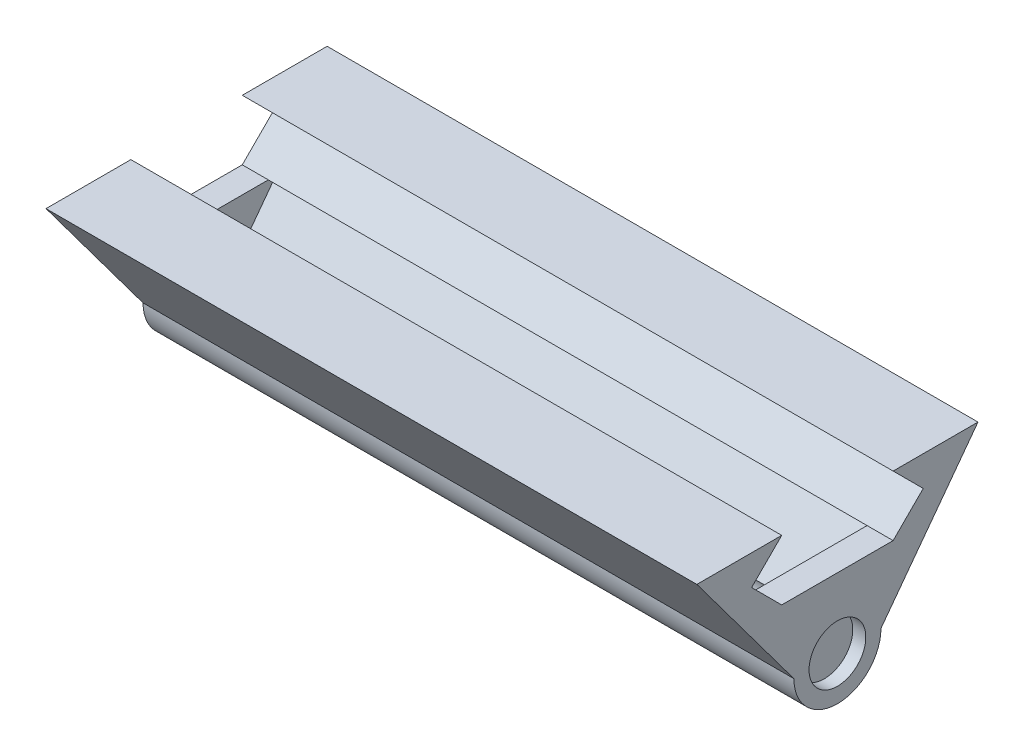
ISO-10303-21;
HEADER;
FILE_DESCRIPTION(('STEP AP214'),'2;1');
FILE_NAME('part.step','',(''),(''),'','','');
FILE_SCHEMA(('AUTOMOTIVE_DESIGN { 1 0 10303 214 1 1 1 1 }'));
ENDSEC;
DATA;
#1=APPLICATION_CONTEXT('core data for automotive mechanical design processes');
#2=APPLICATION_PROTOCOL_DEFINITION('international standard','automotive_design',2000,#1);
#3=PRODUCT_CONTEXT('',#1,'mechanical');
#4=PRODUCT('Part','Part','',(#3));
#5=PRODUCT_RELATED_PRODUCT_CATEGORY('part','',(#4));
#6=PRODUCT_DEFINITION_FORMATION('','',#4);
#7=PRODUCT_DEFINITION_CONTEXT('part definition',#1,'design');
#8=PRODUCT_DEFINITION('design','',#6,#7);
#9=PRODUCT_DEFINITION_SHAPE('','',#8);
#10=(LENGTH_UNIT() NAMED_UNIT(*) SI_UNIT(.MILLI.,.METRE.));
#11=(NAMED_UNIT(*) PLANE_ANGLE_UNIT() SI_UNIT($,.RADIAN.));
#12=(NAMED_UNIT(*) SI_UNIT($,.STERADIAN.) SOLID_ANGLE_UNIT());
#13=UNCERTAINTY_MEASURE_WITH_UNIT(LENGTH_MEASURE(1.E-05),#10,'distance_accuracy_value','');
#14=(GEOMETRIC_REPRESENTATION_CONTEXT(3) GLOBAL_UNCERTAINTY_ASSIGNED_CONTEXT((#13)) GLOBAL_UNIT_ASSIGNED_CONTEXT((#10,
#11,#12)) REPRESENTATION_CONTEXT('',''));
#15=CARTESIAN_POINT('',(0.,0.,0.));
#16=DIRECTION('',(0.,0.,1.));
#17=DIRECTION('',(1.,0.,0.));
#18=AXIS2_PLACEMENT_3D('',#15,#16,#17);
#19=CARTESIAN_POINT('',(15.875,-6.01457594308069,-2.71726651281741));
#20=DIRECTION('',(0.,-1.,0.));
#21=DIRECTION('',(0.,0.,-1.));
#22=AXIS2_PLACEMENT_3D('',#19,#20,#21);
#23=PLANE('',#22);
#24=DIRECTION('',(0.,0.,1.));
#25=VECTOR('',#24,1.);
#26=CARTESIAN_POINT('',(-14.605,-6.01457594308069,-2.71726651281741));
#27=LINE('',#26,#25);
#28=CARTESIAN_POINT('',(-14.605,-6.01457594308069,-2.71726651281741));
#29=VERTEX_POINT('',#28);
#30=CARTESIAN_POINT('',(-14.605,-6.01457594308069,2.71726651281741));
#31=VERTEX_POINT('',#30);
#32=EDGE_CURVE('E11',#29,#31,#27,.T.);
#33=ORIENTED_EDGE('',*,*,#32,.F.);
#34=DIRECTION('',(-1.,0.,0.));
#35=VECTOR('',#34,1.);
#36=CARTESIAN_POINT('',(15.875,-6.01457594308069,-2.71726651281741));
#37=LINE('',#36,#35);
#38=CARTESIAN_POINT('',(-15.875,-6.01457594308069,-2.71726651281741));
#39=VERTEX_POINT('',#38);
#40=EDGE_CURVE('E196',#29,#39,#37,.T.);
#41=ORIENTED_EDGE('',*,*,#40,.T.);
#42=DIRECTION('',(0.,0.,1.));
#43=VECTOR('',#42,1.);
#44=CARTESIAN_POINT('',(-15.875,-6.01457594308069,-2.71726651281741));
#45=LINE('',#44,#43);
#46=CARTESIAN_POINT('',(-15.875,-6.01457594308069,2.71726651281741));
#47=VERTEX_POINT('',#46);
#48=EDGE_CURVE('E169',#39,#47,#45,.T.);
#49=ORIENTED_EDGE('',*,*,#48,.T.);
#50=DIRECTION('',(-1.,0.,0.));
#51=VECTOR('',#50,1.);
#52=CARTESIAN_POINT('',(15.875,-6.01457594308069,2.71726651281741));
#53=LINE('',#52,#51);
#54=EDGE_CURVE('E192',#31,#47,#53,.T.);
#55=ORIENTED_EDGE('',*,*,#54,.F.);
#56=EDGE_LOOP('',(#33,#41,#49,#55));
#57=FACE_BOUND('',#56,.T.);
#58=ADVANCED_FACE('F35',(#57),#23,.F.);
#59=CARTESIAN_POINT('',(15.875,-3.07678234806573,-6.85731176456135));
#60=DIRECTION('',(0.,-1.,0.));
#61=DIRECTION('',(0.,0.,-1.));
#62=AXIS2_PLACEMENT_3D('',#59,#60,#61);
#63=PLANE('',#62);
#64=DIRECTION('',(0.,0.,1.));
#65=VECTOR('',#64,1.);
#66=CARTESIAN_POINT('',(-15.875,-3.07678234806573,-6.85731176456135));
#67=LINE('',#66,#65);
#68=CARTESIAN_POINT('',(-15.875,-3.07678234806573,-6.85731176456135));
#69=VERTEX_POINT('',#68);
#70=CARTESIAN_POINT('',(-15.875,-3.07678234806573,-2.71726651281739));
#71=VERTEX_POINT('',#70);
#72=EDGE_CURVE('E160',#69,#71,#67,.T.);
#73=ORIENTED_EDGE('',*,*,#72,.T.);
#74=DIRECTION('',(-1.,0.,0.));
#75=VECTOR('',#74,1.);
#76=CARTESIAN_POINT('',(15.875,-3.07678234806573,-2.71726651281739));
#77=LINE('',#76,#75);
#78=CARTESIAN_POINT('',(15.875,-3.07678234806573,-2.71726651281739));
#79=VERTEX_POINT('',#78);
#80=EDGE_CURVE('E39',#79,#71,#77,.T.);
#81=ORIENTED_EDGE('',*,*,#80,.F.);
#82=DIRECTION('',(0.,0.,1.));
#83=VECTOR('',#82,1.);
#84=CARTESIAN_POINT('',(15.875,-3.07678234806573,-6.85731176456135));
#85=LINE('',#84,#83);
#86=CARTESIAN_POINT('',(15.875,-3.07678234806573,-6.85731176456135));
#87=VERTEX_POINT('',#86);
#88=EDGE_CURVE('E182',#87,#79,#85,.T.);
#89=ORIENTED_EDGE('',*,*,#88,.F.);
#90=DIRECTION('',(-1.,0.,0.));
#91=VECTOR('',#90,1.);
#92=CARTESIAN_POINT('',(15.875,-3.07678234806573,-6.85731176456135));
#93=LINE('',#92,#91);
#94=EDGE_CURVE('E156',#87,#69,#93,.T.);
#95=ORIENTED_EDGE('',*,*,#94,.T.);
#96=EDGE_LOOP('',(#73,#81,#89,#95));
#97=FACE_BOUND('',#96,.T.);
#98=ADVANCED_FACE('F37',(#97),#63,.F.);
#99=CARTESIAN_POINT('',(15.875,-3.07678234806573,-2.71726651281739));
#100=DIRECTION('',(0.,0.707106781186548,-0.707106781186547));
#101=DIRECTION('',(0.,0.707106781186547,0.707106781186548));
#102=AXIS2_PLACEMENT_3D('',#99,#100,#101);
#103=PLANE('',#102);
#104=DIRECTION('',(0.,-0.707106781186547,-0.707106781186548));
#105=VECTOR('',#104,1.);
#106=CARTESIAN_POINT('',(-15.875,-3.07678234806573,-2.71726651281739));
#107=LINE('',#106,#105);
#108=CARTESIAN_POINT('',(-15.875,-4.54567914557323,-4.18616331032488));
#109=VERTEX_POINT('',#108);
#110=EDGE_CURVE('E163',#71,#109,#107,.T.);
#111=ORIENTED_EDGE('',*,*,#110,.T.);
#112=DIRECTION('',(-1.,0.,0.));
#113=VECTOR('',#112,1.);
#114=CARTESIAN_POINT('',(15.875,-4.54567914557323,-4.18616331032488));
#115=LINE('',#114,#113);
#116=CARTESIAN_POINT('',(15.875,-4.54567914557323,-4.18616331032488));
#117=VERTEX_POINT('',#116);
#118=EDGE_CURVE('E200',#117,#109,#115,.T.);
#119=ORIENTED_EDGE('',*,*,#118,.F.);
#120=DIRECTION('',(0.,-0.707106781186547,-0.707106781186548));
#121=VECTOR('',#120,1.);
#122=CARTESIAN_POINT('',(15.875,-3.07678234806573,-2.71726651281739));
#123=LINE('',#122,#121);
#124=EDGE_CURVE('E111',#79,#117,#123,.T.);
#125=ORIENTED_EDGE('',*,*,#124,.F.);
#126=ORIENTED_EDGE('',*,*,#80,.T.);
#127=EDGE_LOOP('',(#111,#119,#125,#126));
#128=FACE_BOUND('',#127,.T.);
#129=ADVANCED_FACE('F352',(#128),#103,.F.);
#130=CARTESIAN_POINT('',(15.875,-6.01457594308069,-2.71726651281741));
#131=DIRECTION('',(0.,-0.707106781186547,-0.707106781186548));
#132=DIRECTION('',(0.,0.707106781186548,-0.707106781186547));
#133=AXIS2_PLACEMENT_3D('',#130,#131,#132);
#134=PLANE('',#133);
#135=DIRECTION('',(0.,-0.707106781186548,0.707106781186547));
#136=VECTOR('',#135,1.);
#137=CARTESIAN_POINT('',(-15.875,-6.01457594308069,-2.71726651281741));
#138=LINE('',#137,#136);
#139=EDGE_CURVE('E166',#109,#39,#138,.T.);
#140=ORIENTED_EDGE('',*,*,#139,.T.);
#141=ORIENTED_EDGE('',*,*,#40,.F.);
#142=CARTESIAN_POINT('',(14.605,-6.01457594308069,-2.71726651281741));
#143=VERTEX_POINT('',#142);
#144=EDGE_CURVE('E201',#143,#29,#37,.T.);
#145=ORIENTED_EDGE('',*,*,#144,.F.);
#146=CARTESIAN_POINT('',(15.875,-6.01457594308069,-2.71726651281741));
#147=VERTEX_POINT('',#146);
#148=EDGE_CURVE('E198',#147,#143,#37,.T.);
#149=ORIENTED_EDGE('',*,*,#148,.F.);
#150=DIRECTION('',(0.,-0.707106781186548,0.707106781186547));
#151=VECTOR('',#150,1.);
#152=CARTESIAN_POINT('',(15.875,-6.01457594308069,-2.71726651281741));
#153=LINE('',#152,#151);
#154=EDGE_CURVE('E301',#117,#147,#153,.T.);
#155=ORIENTED_EDGE('',*,*,#154,.F.);
#156=ORIENTED_EDGE('',*,*,#118,.T.);
#157=EDGE_LOOP('',(#140,#141,#145,#149,#155,#156));
#158=FACE_BOUND('',#157,.T.);
#159=ADVANCED_FACE('F295',(#158),#134,.F.);
#160=ORIENTED_EDGE('',*,*,#148,.T.);
#161=DIRECTION('',(0.,0.,1.));
#162=VECTOR('',#161,1.);
#163=CARTESIAN_POINT('',(14.605,-6.01457594308069,-2.71726651281741));
#164=LINE('',#163,#162);
#165=CARTESIAN_POINT('',(14.605,-6.01457594308069,2.71726651281741));
#166=VERTEX_POINT('',#165);
#167=EDGE_CURVE('E44',#143,#166,#164,.T.);
#168=ORIENTED_EDGE('',*,*,#167,.T.);
#169=CARTESIAN_POINT('',(15.875,-6.01457594308069,2.71726651281741));
#170=VERTEX_POINT('',#169);
#171=EDGE_CURVE('E193',#170,#166,#53,.T.);
#172=ORIENTED_EDGE('',*,*,#171,.F.);
#173=DIRECTION('',(0.,0.,1.));
#174=VECTOR('',#173,1.);
#175=CARTESIAN_POINT('',(15.875,-6.01457594308069,-2.71726651281741));
#176=LINE('',#175,#174);
#177=EDGE_CURVE('E298',#147,#170,#176,.T.);
#178=ORIENTED_EDGE('',*,*,#177,.F.);
#179=EDGE_LOOP('',(#160,#168,#172,#178));
#180=FACE_BOUND('',#179,.T.);
#181=ADVANCED_FACE('F297',(#180),#23,.F.);
#182=CARTESIAN_POINT('',(15.875,-6.01457594308069,2.71726651281741));
#183=DIRECTION('',(0.,-0.707106781186548,0.707106781186548));
#184=DIRECTION('',(0.,-0.707106781186548,-0.707106781186548));
#185=AXIS2_PLACEMENT_3D('',#182,#183,#184);
#186=PLANE('',#185);
#187=DIRECTION('',(0.,0.707106781186548,0.707106781186548));
#188=VECTOR('',#187,1.);
#189=CARTESIAN_POINT('',(-15.875,-6.01457594308069,2.71726651281741));
#190=LINE('',#189,#188);
#191=CARTESIAN_POINT('',(-15.875,-4.54567914557323,4.18616331032488));
#192=VERTEX_POINT('',#191);
#193=EDGE_CURVE('E172',#47,#192,#190,.T.);
#194=ORIENTED_EDGE('',*,*,#193,.T.);
#195=DIRECTION('',(-1.,0.,0.));
#196=VECTOR('',#195,1.);
#197=CARTESIAN_POINT('',(15.875,-4.54567914557323,4.18616331032488));
#198=LINE('',#197,#196);
#199=CARTESIAN_POINT('',(15.875,-4.54567914557323,4.18616331032488));
#200=VERTEX_POINT('',#199);
#201=EDGE_CURVE('E189',#200,#192,#198,.T.);
#202=ORIENTED_EDGE('',*,*,#201,.F.);
#203=DIRECTION('',(0.,0.707106781186548,0.707106781186548));
#204=VECTOR('',#203,1.);
#205=CARTESIAN_POINT('',(15.875,-6.01457594308069,2.71726651281741));
#206=LINE('',#205,#204);
#207=EDGE_CURVE('E300',#170,#200,#206,.T.);
#208=ORIENTED_EDGE('',*,*,#207,.F.);
#209=ORIENTED_EDGE('',*,*,#171,.T.);
#210=EDGE_CURVE('E197',#166,#31,#53,.T.);
#211=ORIENTED_EDGE('',*,*,#210,.T.);
#212=ORIENTED_EDGE('',*,*,#54,.T.);
#213=EDGE_LOOP('',(#194,#202,#208,#209,#211,#212));
#214=FACE_BOUND('',#213,.T.);
#215=ADVANCED_FACE('F356',(#214),#186,.F.);
#216=CARTESIAN_POINT('',(15.875,-3.07678234806574,2.71726651281739));
#217=DIRECTION('',(0.,0.707106781186547,0.707106781186548));
#218=DIRECTION('',(0.,-0.707106781186548,0.707106781186547));
#219=AXIS2_PLACEMENT_3D('',#216,#217,#218);
#220=PLANE('',#219);
#221=DIRECTION('',(0.,0.707106781186548,-0.707106781186547));
#222=VECTOR('',#221,1.);
#223=CARTESIAN_POINT('',(-15.875,-3.07678234806574,2.71726651281739));
#224=LINE('',#223,#222);
#225=CARTESIAN_POINT('',(-15.875,-3.07678234806574,2.71726651281739));
#226=VERTEX_POINT('',#225);
#227=EDGE_CURVE('E174',#192,#226,#224,.T.);
#228=ORIENTED_EDGE('',*,*,#227,.T.);
#229=DIRECTION('',(-1.,0.,0.));
#230=VECTOR('',#229,1.);
#231=CARTESIAN_POINT('',(15.875,-3.07678234806574,2.71726651281739));
#232=LINE('',#231,#230);
#233=CARTESIAN_POINT('',(15.875,-3.07678234806574,2.71726651281739));
#234=VERTEX_POINT('',#233);
#235=EDGE_CURVE('E186',#234,#226,#232,.T.);
#236=ORIENTED_EDGE('',*,*,#235,.F.);
#237=DIRECTION('',(0.,0.707106781186548,-0.707106781186547));
#238=VECTOR('',#237,1.);
#239=CARTESIAN_POINT('',(15.875,-3.07678234806574,2.71726651281739));
#240=LINE('',#239,#238);
#241=EDGE_CURVE('E303',#200,#234,#240,.T.);
#242=ORIENTED_EDGE('',*,*,#241,.F.);
#243=ORIENTED_EDGE('',*,*,#201,.T.);
#244=EDGE_LOOP('',(#228,#236,#242,#243));
#245=FACE_BOUND('',#244,.T.);
#246=ADVANCED_FACE('F312',(#245),#220,.F.);
#247=CARTESIAN_POINT('',(15.875,-3.07678234806574,6.85731176456135));
#248=DIRECTION('',(0.,-1.,0.));
#249=DIRECTION('',(0.,0.,-1.));
#250=AXIS2_PLACEMENT_3D('',#247,#248,#249);
#251=PLANE('',#250);
#252=DIRECTION('',(0.,0.,1.));
#253=VECTOR('',#252,1.);
#254=CARTESIAN_POINT('',(-15.875,-3.07678234806574,6.85731176456135));
#255=LINE('',#254,#253);
#256=CARTESIAN_POINT('',(-15.875,-3.07678234806574,6.85731176456135));
#257=VERTEX_POINT('',#256);
#258=EDGE_CURVE('E176',#226,#257,#255,.T.);
#259=ORIENTED_EDGE('',*,*,#258,.T.);
#260=DIRECTION('',(-1.,0.,0.));
#261=VECTOR('',#260,1.);
#262=CARTESIAN_POINT('',(15.875,-3.07678234806574,6.85731176456135));
#263=LINE('',#262,#261);
#264=CARTESIAN_POINT('',(15.875,-3.07678234806574,6.85731176456135));
#265=VERTEX_POINT('',#264);
#266=EDGE_CURVE('E151',#265,#257,#263,.T.);
#267=ORIENTED_EDGE('',*,*,#266,.F.);
#268=DIRECTION('',(0.,0.,1.));
#269=VECTOR('',#268,1.);
#270=CARTESIAN_POINT('',(15.875,-3.07678234806574,6.85731176456135));
#271=LINE('',#270,#269);
#272=EDGE_CURVE('E139',#234,#265,#271,.T.);
#273=ORIENTED_EDGE('',*,*,#272,.F.);
#274=ORIENTED_EDGE('',*,*,#235,.T.);
#275=EDGE_LOOP('',(#259,#267,#273,#274));
#276=FACE_BOUND('',#275,.T.);
#277=ADVANCED_FACE('F316',(#276),#251,.F.);
#278=CARTESIAN_POINT('',(15.875,-3.07678234806574,6.85731176456135));
#279=DIRECTION('',(0.,0.597668162753968,-0.801743579475568));
#280=DIRECTION('',(0.,0.801743579475568,0.597668162753968));
#281=AXIS2_PLACEMENT_3D('',#278,#279,#280);
#282=PLANE('',#281);
#283=DIRECTION('',(0.,-0.801743579475568,-0.597668162753968));
#284=VECTOR('',#283,1.);
#285=CARTESIAN_POINT('',(-15.875,-3.07678234806574,6.85731176456135));
#286=LINE('',#285,#284);
#287=CARTESIAN_POINT('',(-15.875,-9.42678234806574,2.12363764400252));
#288=VERTEX_POINT('',#287);
#289=EDGE_CURVE('E148',#257,#288,#286,.T.);
#290=ORIENTED_EDGE('',*,*,#289,.T.);
#291=DIRECTION('',(-1.,0.,0.));
#292=VECTOR('',#291,1.);
#293=CARTESIAN_POINT('',(15.875,-9.42678234806574,2.12363764400252));
#294=LINE('',#293,#292);
#295=CARTESIAN_POINT('',(15.875,-9.42678234806574,2.12363764400252));
#296=VERTEX_POINT('',#295);
#297=EDGE_CURVE('E145',#296,#288,#294,.T.);
#298=ORIENTED_EDGE('',*,*,#297,.F.);
#299=DIRECTION('',(0.,-0.801743579475568,-0.597668162753968));
#300=VECTOR('',#299,1.);
#301=CARTESIAN_POINT('',(15.875,-3.07678234806574,6.85731176456135));
#302=LINE('',#301,#300);
#303=EDGE_CURVE('E132',#265,#296,#302,.T.);
#304=ORIENTED_EDGE('',*,*,#303,.F.);
#305=ORIENTED_EDGE('',*,*,#266,.T.);
#306=EDGE_LOOP('',(#290,#298,#304,#305));
#307=FACE_BOUND('',#306,.T.);
#308=ADVANCED_FACE('F146',(#307),#282,.F.);
#309=CARTESIAN_POINT('',(15.875,-9.42678234806574,0.));
#310=DIRECTION('',(-1.,0.,0.));
#311=DIRECTION('',(0.,0.,1.));
#312=AXIS2_PLACEMENT_3D('',#309,#310,#311);
#313=CYLINDRICAL_SURFACE('',#312,2.12363764400252);
#314=CARTESIAN_POINT('',(-15.875,-9.42678234806574,0.));
#315=DIRECTION('',(1.,0.,0.));
#316=DIRECTION('',(0.,0.,-1.));
#317=AXIS2_PLACEMENT_3D('',#314,#315,#316);
#318=CIRCLE('',#317,2.12363764400252);
#319=CARTESIAN_POINT('',(-15.875,-9.42678234806574,-2.12363764400252));
#320=VERTEX_POINT('',#319);
#321=EDGE_CURVE('E179',#288,#320,#318,.T.);
#322=ORIENTED_EDGE('',*,*,#321,.T.);
#323=DIRECTION('',(-1.,0.,0.));
#324=VECTOR('',#323,1.);
#325=CARTESIAN_POINT('',(15.875,-9.42678234806574,-2.12363764400252));
#326=LINE('',#325,#324);
#327=CARTESIAN_POINT('',(15.875,-9.42678234806574,-2.12363764400252));
#328=VERTEX_POINT('',#327);
#329=EDGE_CURVE('E152',#328,#320,#326,.T.);
#330=ORIENTED_EDGE('',*,*,#329,.F.);
#331=CARTESIAN_POINT('',(15.875,-9.42678234806574,0.));
#332=DIRECTION('',(1.,0.,0.));
#333=DIRECTION('',(0.,0.,-1.));
#334=AXIS2_PLACEMENT_3D('',#331,#332,#333);
#335=CIRCLE('',#334,2.12363764400252);
#336=EDGE_CURVE('E136',#296,#328,#335,.T.);
#337=ORIENTED_EDGE('',*,*,#336,.F.);
#338=ORIENTED_EDGE('',*,*,#297,.T.);
#339=EDGE_LOOP('',(#322,#330,#337,#338));
#340=FACE_BOUND('',#339,.T.);
#341=ADVANCED_FACE('F154',(#340),#313,.T.);
#342=CARTESIAN_POINT('',(15.875,-3.07678234806573,-6.85731176456135));
#343=DIRECTION('',(0.,0.597668162753968,0.801743579475568));
#344=DIRECTION('',(0.,-0.801743579475568,0.597668162753968));
#345=AXIS2_PLACEMENT_3D('',#342,#343,#344);
#346=PLANE('',#345);
#347=DIRECTION('',(0.,0.801743579475568,-0.597668162753968));
#348=VECTOR('',#347,1.);
#349=CARTESIAN_POINT('',(-15.875,-3.07678234806573,-6.85731176456135));
#350=LINE('',#349,#348);
#351=EDGE_CURVE('E102',#320,#69,#350,.T.);
#352=ORIENTED_EDGE('',*,*,#351,.T.);
#353=ORIENTED_EDGE('',*,*,#94,.F.);
#354=DIRECTION('',(0.,0.801743579475568,-0.597668162753968));
#355=VECTOR('',#354,1.);
#356=CARTESIAN_POINT('',(15.875,-3.07678234806573,-6.85731176456135));
#357=LINE('',#356,#355);
#358=EDGE_CURVE('E63',#328,#87,#357,.T.);
#359=ORIENTED_EDGE('',*,*,#358,.F.);
#360=ORIENTED_EDGE('',*,*,#329,.T.);
#361=EDGE_LOOP('',(#352,#353,#359,#360));
#362=FACE_BOUND('',#361,.T.);
#363=ADVANCED_FACE('F320',(#362),#346,.F.);
#364=CARTESIAN_POINT('',(15.875,-9.42678234806574,0.));
#365=DIRECTION('',(1.,0.,0.));
#366=DIRECTION('',(0.,0.,-1.));
#367=AXIS2_PLACEMENT_3D('',#364,#365,#366);
#368=PLANE('',#367);
#369=CARTESIAN_POINT('',(15.875,-9.42678234806574,0.));
#370=DIRECTION('',(-1.,0.,0.));
#371=DIRECTION('',(0.,0.,1.));
#372=AXIS2_PLACEMENT_3D('',#369,#370,#371);
#373=CIRCLE('',#372,1.38391890759363);
#374=CARTESIAN_POINT('',(15.875,-9.42678234806574,1.38391890759363));
#375=VERTEX_POINT('',#374);
#376=EDGE_CURVE('E250',#375,#375,#373,.T.);
#377=ORIENTED_EDGE('',*,*,#376,.T.);
#378=EDGE_LOOP('',(#377));
#379=FACE_BOUND('',#378,.T.);
#380=ORIENTED_EDGE('',*,*,#88,.T.);
#381=ORIENTED_EDGE('',*,*,#124,.T.);
#382=ORIENTED_EDGE('',*,*,#154,.T.);
#383=ORIENTED_EDGE('',*,*,#177,.T.);
#384=ORIENTED_EDGE('',*,*,#207,.T.);
#385=ORIENTED_EDGE('',*,*,#241,.T.);
#386=ORIENTED_EDGE('',*,*,#272,.T.);
#387=ORIENTED_EDGE('',*,*,#303,.T.);
#388=ORIENTED_EDGE('',*,*,#336,.T.);
#389=ORIENTED_EDGE('',*,*,#358,.T.);
#390=EDGE_LOOP('',(#380,#381,#382,#383,#384,#385,#386,#387,#388,#389));
#391=FACE_BOUND('',#390,.T.);
#392=ADVANCED_FACE('F134',(#379,#391),#368,.T.);
#393=CARTESIAN_POINT('',(-15.875,-9.42678234806574,0.));
#394=DIRECTION('',(1.,0.,0.));
#395=DIRECTION('',(0.,0.,-1.));
#396=AXIS2_PLACEMENT_3D('',#393,#394,#395);
#397=PLANE('',#396);
#398=CARTESIAN_POINT('',(-15.875,-9.42678234806574,0.));
#399=DIRECTION('',(-1.,0.,0.));
#400=DIRECTION('',(0.,0.,1.));
#401=AXIS2_PLACEMENT_3D('',#398,#399,#400);
#402=CIRCLE('',#401,1.38391890759363);
#403=CARTESIAN_POINT('',(-15.875,-9.42678234806574,1.38391890759363));
#404=VERTEX_POINT('',#403);
#405=EDGE_CURVE('E242',#404,#404,#402,.T.);
#406=ORIENTED_EDGE('',*,*,#405,.F.);
#407=EDGE_LOOP('',(#406));
#408=FACE_BOUND('',#407,.T.);
#409=ORIENTED_EDGE('',*,*,#72,.F.);
#410=ORIENTED_EDGE('',*,*,#351,.F.);
#411=ORIENTED_EDGE('',*,*,#321,.F.);
#412=ORIENTED_EDGE('',*,*,#289,.F.);
#413=ORIENTED_EDGE('',*,*,#258,.F.);
#414=ORIENTED_EDGE('',*,*,#227,.F.);
#415=ORIENTED_EDGE('',*,*,#193,.F.);
#416=ORIENTED_EDGE('',*,*,#48,.F.);
#417=ORIENTED_EDGE('',*,*,#139,.F.);
#418=ORIENTED_EDGE('',*,*,#110,.F.);
#419=EDGE_LOOP('',(#409,#410,#411,#412,#413,#414,#415,#416,#417,#418));
#420=FACE_BOUND('',#419,.T.);
#421=ADVANCED_FACE('F319',(#408,#420),#397,.F.);
#422=CARTESIAN_POINT('',(15.875,-6.01457594308069,-2.71726651281741));
#423=DIRECTION('',(0.,-1.,0.));
#424=DIRECTION('',(0.,0.,-1.));
#425=AXIS2_PLACEMENT_3D('',#422,#423,#424);
#426=PLANE('',#425);
#427=ORIENTED_EDGE('',*,*,#144,.T.);
#428=CARTESIAN_POINT('',(-14.605,-6.01457594308069,-3.08325509863557));
#429=VERTEX_POINT('',#428);
#430=EDGE_CURVE('E46',#429,#29,#27,.T.);
#431=ORIENTED_EDGE('',*,*,#430,.F.);
#432=DIRECTION('',(1.,0.,0.));
#433=VECTOR('',#432,1.);
#434=CARTESIAN_POINT('',(15.875,-6.01457594308069,-3.08325509863557));
#435=LINE('',#434,#433);
#436=CARTESIAN_POINT('',(14.605,-6.01457594308069,-3.08325509863557));
#437=VERTEX_POINT('',#436);
#438=EDGE_CURVE('E263',#429,#437,#435,.T.);
#439=ORIENTED_EDGE('',*,*,#438,.T.);
#440=EDGE_CURVE('E209',#437,#143,#164,.T.);
#441=ORIENTED_EDGE('',*,*,#440,.T.);
#442=EDGE_LOOP('',(#427,#431,#439,#441));
#443=FACE_BOUND('',#442,.T.);
#444=ADVANCED_FACE('F291',(#443),#426,.T.);
#445=CARTESIAN_POINT('',(14.605,-6.0145759430807,3.08325509863556));
#446=VERTEX_POINT('',#445);
#447=EDGE_CURVE('E54',#166,#446,#164,.T.);
#448=ORIENTED_EDGE('',*,*,#447,.T.);
#449=DIRECTION('',(1.,0.,0.));
#450=VECTOR('',#449,1.);
#451=CARTESIAN_POINT('',(15.875,-6.01457594308069,3.08325509863557));
#452=LINE('',#451,#450);
#453=CARTESIAN_POINT('',(-14.605,-6.01457594308069,3.08325509863557));
#454=VERTEX_POINT('',#453);
#455=EDGE_CURVE('E164',#454,#446,#452,.T.);
#456=ORIENTED_EDGE('',*,*,#455,.F.);
#457=EDGE_CURVE('E47',#31,#454,#27,.T.);
#458=ORIENTED_EDGE('',*,*,#457,.F.);
#459=ORIENTED_EDGE('',*,*,#210,.F.);
#460=EDGE_LOOP('',(#448,#456,#458,#459));
#461=FACE_BOUND('',#460,.T.);
#462=ADVANCED_FACE('F327',(#461),#426,.T.);
#463=CARTESIAN_POINT('',(15.875,-2.3177437813682,5.83909741862738));
#464=DIRECTION('',(0.,0.597668162753968,-0.801743579475568));
#465=DIRECTION('',(0.,0.801743579475568,0.597668162753968));
#466=AXIS2_PLACEMENT_3D('',#463,#464,#465);
#467=PLANE('',#466);
#468=ORIENTED_EDGE('',*,*,#455,.T.);
#469=DIRECTION('',(0.,-0.801743579475568,-0.597668162753968));
#470=VECTOR('',#469,1.);
#471=CARTESIAN_POINT('',(14.605,-2.3177437813682,5.83909741862738));
#472=LINE('',#471,#470);
#473=CARTESIAN_POINT('',(14.605,-9.09534114578943,0.786666356654381));
#474=VERTEX_POINT('',#473);
#475=EDGE_CURVE('E214',#446,#474,#472,.T.);
#476=ORIENTED_EDGE('',*,*,#475,.T.);
#477=DIRECTION('',(-1.,0.,0.));
#478=VECTOR('',#477,1.);
#479=CARTESIAN_POINT('',(14.605,-9.09534114578943,0.786666356654381));
#480=LINE('',#479,#478);
#481=CARTESIAN_POINT('',(-14.605,-9.09534114578943,0.786666356654381));
#482=VERTEX_POINT('',#481);
#483=EDGE_CURVE('E261',#474,#482,#480,.T.);
#484=ORIENTED_EDGE('',*,*,#483,.T.);
#485=DIRECTION('',(0.,-0.801743579475568,-0.597668162753968));
#486=VECTOR('',#485,1.);
#487=CARTESIAN_POINT('',(-14.605,-2.3177437813682,5.83909741862738));
#488=LINE('',#487,#486);
#489=EDGE_CURVE('E229',#454,#482,#488,.T.);
#490=ORIENTED_EDGE('',*,*,#489,.F.);
#491=EDGE_LOOP('',(#468,#476,#484,#490));
#492=FACE_BOUND('',#491,.T.);
#493=ADVANCED_FACE('F325',(#492),#467,.T.);
#494=CARTESIAN_POINT('',(15.875,-9.42678234806574,0.));
#495=DIRECTION('',(-1.,0.,0.));
#496=DIRECTION('',(0.,0.,1.));
#497=AXIS2_PLACEMENT_3D('',#494,#495,#496);
#498=CYLINDRICAL_SURFACE('',#497,0.853637644002522);
#499=CARTESIAN_POINT('',(-14.605,-9.42678234806574,0.));
#500=DIRECTION('',(1.,0.,0.));
#501=DIRECTION('',(0.,0.,-1.));
#502=AXIS2_PLACEMENT_3D('',#499,#500,#501);
#503=CIRCLE('',#502,0.853637644002522);
#504=CARTESIAN_POINT('',(-14.605,-9.09534114578943,-0.786666356654384));
#505=VERTEX_POINT('',#504);
#506=EDGE_CURVE('E221',#482,#505,#503,.T.);
#507=ORIENTED_EDGE('',*,*,#506,.F.);
#508=ORIENTED_EDGE('',*,*,#483,.F.);
#509=CARTESIAN_POINT('',(14.605,-9.42678234806574,0.));
#510=DIRECTION('',(1.,0.,0.));
#511=DIRECTION('',(0.,0.,-1.));
#512=AXIS2_PLACEMENT_3D('',#509,#510,#511);
#513=CIRCLE('',#512,0.853637644002522);
#514=CARTESIAN_POINT('',(14.605,-9.09534114578943,-0.786666356654384));
#515=VERTEX_POINT('',#514);
#516=EDGE_CURVE('E255',#474,#515,#513,.T.);
#517=ORIENTED_EDGE('',*,*,#516,.T.);
#518=DIRECTION('',(-1.,0.,0.));
#519=VECTOR('',#518,1.);
#520=CARTESIAN_POINT('',(14.605,-9.09534114578943,-0.786666356654384));
#521=LINE('',#520,#519);
#522=EDGE_CURVE('E232',#515,#505,#521,.T.);
#523=ORIENTED_EDGE('',*,*,#522,.T.);
#524=EDGE_LOOP('',(#507,#508,#517,#523));
#525=FACE_BOUND('',#524,.T.);
#526=ADVANCED_FACE('F274',(#525),#498,.F.);
#527=CARTESIAN_POINT('',(15.875,-2.3177437813682,-5.83909741862738));
#528=DIRECTION('',(0.,0.597668162753968,0.801743579475568));
#529=DIRECTION('',(0.,-0.801743579475568,0.597668162753968));
#530=AXIS2_PLACEMENT_3D('',#527,#528,#529);
#531=PLANE('',#530);
#532=DIRECTION('',(0.,0.801743579475568,-0.597668162753968));
#533=VECTOR('',#532,1.);
#534=CARTESIAN_POINT('',(-14.605,-2.3177437813682,-5.83909741862738));
#535=LINE('',#534,#533);
#536=EDGE_CURVE('E215',#505,#429,#535,.T.);
#537=ORIENTED_EDGE('',*,*,#536,.F.);
#538=ORIENTED_EDGE('',*,*,#522,.F.);
#539=DIRECTION('',(0.,0.801743579475568,-0.597668162753968));
#540=VECTOR('',#539,1.);
#541=CARTESIAN_POINT('',(14.605,-2.3177437813682,-5.83909741862738));
#542=LINE('',#541,#540);
#543=EDGE_CURVE('E258',#515,#437,#542,.T.);
#544=ORIENTED_EDGE('',*,*,#543,.T.);
#545=ORIENTED_EDGE('',*,*,#438,.F.);
#546=EDGE_LOOP('',(#537,#538,#544,#545));
#547=FACE_BOUND('',#546,.T.);
#548=ADVANCED_FACE('F281',(#547),#531,.T.);
#549=CARTESIAN_POINT('',(14.605,-9.42678234806574,0.));
#550=DIRECTION('',(1.,0.,0.));
#551=DIRECTION('',(0.,0.,-1.));
#552=AXIS2_PLACEMENT_3D('',#549,#550,#551);
#553=PLANE('',#552);
#554=ORIENTED_EDGE('',*,*,#543,.F.);
#555=ORIENTED_EDGE('',*,*,#516,.F.);
#556=ORIENTED_EDGE('',*,*,#475,.F.);
#557=ORIENTED_EDGE('',*,*,#447,.F.);
#558=ORIENTED_EDGE('',*,*,#167,.F.);
#559=ORIENTED_EDGE('',*,*,#440,.F.);
#560=EDGE_LOOP('',(#554,#555,#556,#557,#558,#559));
#561=FACE_BOUND('',#560,.T.);
#562=ADVANCED_FACE('F286',(#561),#553,.F.);
#563=CARTESIAN_POINT('',(-14.605,-9.42678234806574,0.));
#564=DIRECTION('',(1.,0.,0.));
#565=DIRECTION('',(0.,0.,-1.));
#566=AXIS2_PLACEMENT_3D('',#563,#564,#565);
#567=PLANE('',#566);
#568=ORIENTED_EDGE('',*,*,#430,.T.);
#569=ORIENTED_EDGE('',*,*,#32,.T.);
#570=ORIENTED_EDGE('',*,*,#457,.T.);
#571=ORIENTED_EDGE('',*,*,#489,.T.);
#572=ORIENTED_EDGE('',*,*,#506,.T.);
#573=ORIENTED_EDGE('',*,*,#536,.T.);
#574=EDGE_LOOP('',(#568,#569,#570,#571,#572,#573));
#575=FACE_BOUND('',#574,.T.);
#576=ADVANCED_FACE('F333',(#575),#567,.T.);
#577=CARTESIAN_POINT('',(-15.24,-9.42678234806574,0.));
#578=DIRECTION('',(-1.,0.,0.));
#579=DIRECTION('',(0.,0.,1.));
#580=AXIS2_PLACEMENT_3D('',#577,#578,#579);
#581=CYLINDRICAL_SURFACE('',#580,1.38391890759363);
#582=CARTESIAN_POINT('',(-15.24,-9.42678234806574,0.));
#583=DIRECTION('',(-1.,0.,0.));
#584=DIRECTION('',(0.,0.,1.));
#585=AXIS2_PLACEMENT_3D('',#582,#583,#584);
#586=CIRCLE('',#585,1.38391890759363);
#587=CARTESIAN_POINT('',(-15.24,-9.42678234806574,1.38391890759363));
#588=VERTEX_POINT('',#587);
#589=EDGE_CURVE('E238',#588,#588,#586,.T.);
#590=ORIENTED_EDGE('',*,*,#589,.F.);
#591=EDGE_LOOP('',(#590));
#592=FACE_BOUND('',#591,.T.);
#593=ORIENTED_EDGE('',*,*,#405,.T.);
#594=EDGE_LOOP('',(#593));
#595=FACE_BOUND('',#594,.T.);
#596=ADVANCED_FACE('F335',(#592,#595),#581,.F.);
#597=CARTESIAN_POINT('',(-15.24,-9.42678234806574,0.));
#598=DIRECTION('',(-1.,0.,0.));
#599=DIRECTION('',(0.,0.,1.));
#600=AXIS2_PLACEMENT_3D('',#597,#598,#599);
#601=PLANE('',#600);
#602=ORIENTED_EDGE('',*,*,#589,.T.);
#603=EDGE_LOOP('',(#602));
#604=FACE_BOUND('',#603,.T.);
#605=ADVANCED_FACE('F341',(#604),#601,.T.);
#606=CARTESIAN_POINT('',(15.24,-9.42678234806574,0.));
#607=DIRECTION('',(1.,0.,0.));
#608=DIRECTION('',(0.,0.,-1.));
#609=AXIS2_PLACEMENT_3D('',#606,#607,#608);
#610=CYLINDRICAL_SURFACE('',#609,1.38391890759363);
#611=CARTESIAN_POINT('',(15.24,-9.42678234806574,0.));
#612=DIRECTION('',(-1.,0.,0.));
#613=DIRECTION('',(0.,0.,1.));
#614=AXIS2_PLACEMENT_3D('',#611,#612,#613);
#615=CIRCLE('',#614,1.38391890759363);
#616=CARTESIAN_POINT('',(15.24,-9.42678234806574,1.38391890759363));
#617=VERTEX_POINT('',#616);
#618=EDGE_CURVE('E247',#617,#617,#615,.T.);
#619=ORIENTED_EDGE('',*,*,#618,.T.);
#620=EDGE_LOOP('',(#619));
#621=FACE_BOUND('',#620,.T.);
#622=ORIENTED_EDGE('',*,*,#376,.F.);
#623=EDGE_LOOP('',(#622));
#624=FACE_BOUND('',#623,.T.);
#625=ADVANCED_FACE('F503',(#621,#624),#610,.F.);
#626=CARTESIAN_POINT('',(15.24,-9.42678234806574,0.));
#627=DIRECTION('',(1.,0.,0.));
#628=DIRECTION('',(0.,0.,1.));
#629=AXIS2_PLACEMENT_3D('',#626,#627,#628);
#630=PLANE('',#629);
#631=ORIENTED_EDGE('',*,*,#618,.F.);
#632=EDGE_LOOP('',(#631));
#633=FACE_BOUND('',#632,.T.);
#634=ADVANCED_FACE('F510',(#633),#630,.T.);
#635=CLOSED_SHELL('',(#58,#98,#129,#159,#181,#215,#246,#277,#308,#341,#363,#392,#421,#444,#462,
#493,#526,#548,#562,#576,#596,#605,#625,#634));
#636=MANIFOLD_SOLID_BREP('B2',#635);
#637=ADVANCED_BREP_SHAPE_REPRESENTATION('',(#18,#636),#14);
#638=SHAPE_DEFINITION_REPRESENTATION(#9,#637);
ENDSEC;
END-ISO-10303-21;
